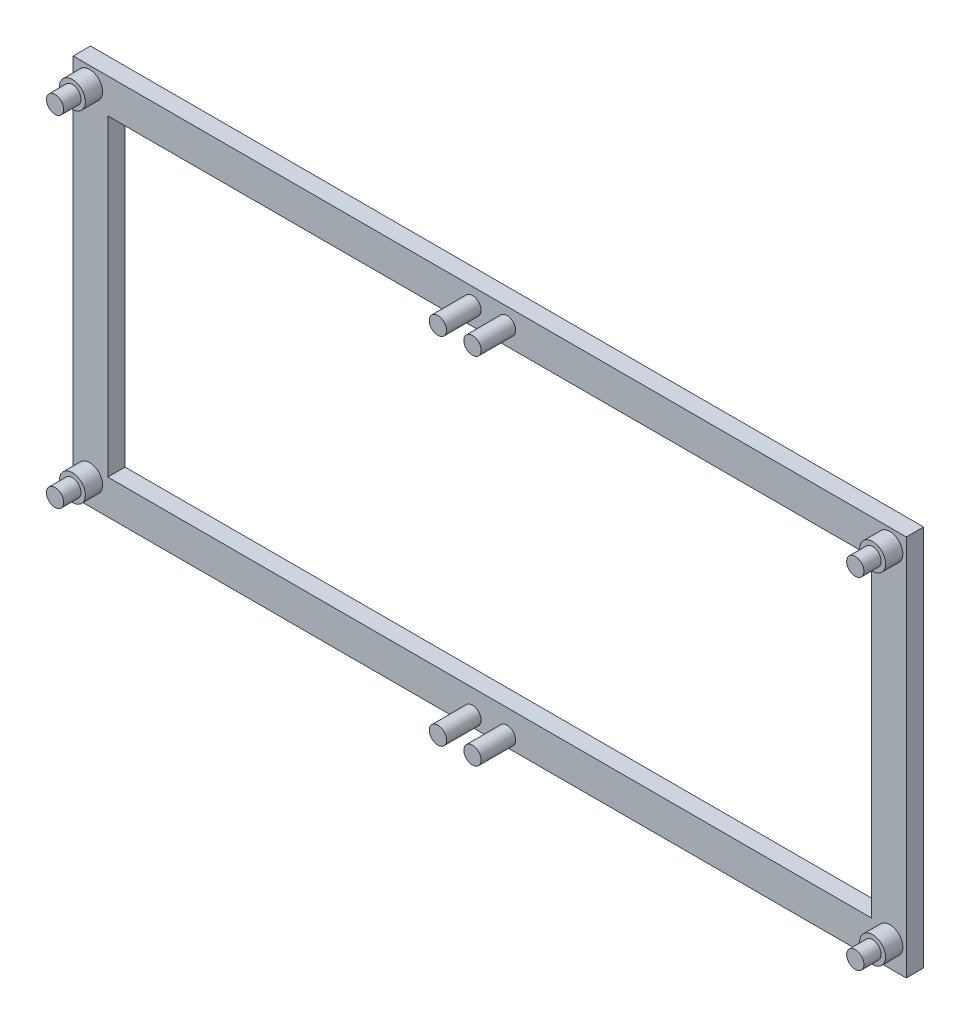
ISO-10303-21;
HEADER;
FILE_DESCRIPTION(('STEP AP214'),'2;1');
FILE_NAME('part.step','',(''),(''),'','','');
FILE_SCHEMA(('AUTOMOTIVE_DESIGN { 1 0 10303 214 1 1 1 1 }'));
ENDSEC;
DATA;
#1=APPLICATION_CONTEXT('core data for automotive mechanical design processes');
#2=APPLICATION_PROTOCOL_DEFINITION('international standard','automotive_design',2000,#1);
#3=PRODUCT_CONTEXT('',#1,'mechanical');
#4=PRODUCT('Part','Part','',(#3));
#5=PRODUCT_RELATED_PRODUCT_CATEGORY('part','',(#4));
#6=PRODUCT_DEFINITION_FORMATION('','',#4);
#7=PRODUCT_DEFINITION_CONTEXT('part definition',#1,'design');
#8=PRODUCT_DEFINITION('design','',#6,#7);
#9=PRODUCT_DEFINITION_SHAPE('','',#8);
#10=(LENGTH_UNIT() NAMED_UNIT(*) SI_UNIT(.MILLI.,.METRE.));
#11=(NAMED_UNIT(*) PLANE_ANGLE_UNIT() SI_UNIT($,.RADIAN.));
#12=(NAMED_UNIT(*) SI_UNIT($,.STERADIAN.) SOLID_ANGLE_UNIT());
#13=UNCERTAINTY_MEASURE_WITH_UNIT(LENGTH_MEASURE(1.E-05),#10,'distance_accuracy_value','');
#14=(GEOMETRIC_REPRESENTATION_CONTEXT(3) GLOBAL_UNCERTAINTY_ASSIGNED_CONTEXT((#13)) GLOBAL_UNIT_ASSIGNED_CONTEXT((#10,
#11,#12)) REPRESENTATION_CONTEXT('',''));
#15=CARTESIAN_POINT('',(0.,0.,0.));
#16=DIRECTION('',(0.,0.,1.));
#17=DIRECTION('',(1.,0.,0.));
#18=AXIS2_PLACEMENT_3D('',#15,#16,#17);
#19=CARTESIAN_POINT('',(0.,0.,2.));
#20=DIRECTION('',(0.,0.,1.));
#21=DIRECTION('',(1.,0.,0.));
#22=AXIS2_PLACEMENT_3D('',#19,#20,#21);
#23=PLANE('',#22);
#24=CARTESIAN_POINT('',(46.3,20.2,2.));
#25=DIRECTION('',(0.,0.,1.));
#26=DIRECTION('',(1.,0.,0.));
#27=AXIS2_PLACEMENT_3D('',#24,#25,#26);
#28=CIRCLE('',#27,1.5);
#29=CARTESIAN_POINT('',(47.8,20.2,2.));
#30=VERTEX_POINT('',#29);
#31=EDGE_CURVE('E192',#30,#30,#28,.T.);
#32=ORIENTED_EDGE('',*,*,#31,.F.);
#33=EDGE_LOOP('',(#32));
#34=FACE_BOUND('',#33,.T.);
#35=CARTESIAN_POINT('',(46.3,-19.2,2.));
#36=DIRECTION('',(0.,0.,1.));
#37=DIRECTION('',(1.,0.,0.));
#38=AXIS2_PLACEMENT_3D('',#35,#36,#37);
#39=CIRCLE('',#38,1.5);
#40=CARTESIAN_POINT('',(47.8,-19.2,2.));
#41=VERTEX_POINT('',#40);
#42=EDGE_CURVE('E185',#41,#41,#39,.T.);
#43=ORIENTED_EDGE('',*,*,#42,.F.);
#44=EDGE_LOOP('',(#43));
#45=FACE_BOUND('',#44,.T.);
#46=CARTESIAN_POINT('',(-46.3,-19.2,2.));
#47=DIRECTION('',(0.,0.,1.));
#48=DIRECTION('',(1.,0.,0.));
#49=AXIS2_PLACEMENT_3D('',#46,#47,#48);
#50=CIRCLE('',#49,1.5);
#51=CARTESIAN_POINT('',(-44.8,-19.2,2.));
#52=VERTEX_POINT('',#51);
#53=EDGE_CURVE('E178',#52,#52,#50,.T.);
#54=ORIENTED_EDGE('',*,*,#53,.F.);
#55=EDGE_LOOP('',(#54));
#56=FACE_BOUND('',#55,.T.);
#57=CARTESIAN_POINT('',(-46.3,20.2,2.));
#58=DIRECTION('',(0.,0.,1.));
#59=DIRECTION('',(1.,0.,0.));
#60=AXIS2_PLACEMENT_3D('',#57,#58,#59);
#61=CIRCLE('',#60,1.5);
#62=CARTESIAN_POINT('',(-44.8,20.2,2.));
#63=VERTEX_POINT('',#62);
#64=EDGE_CURVE('E174',#63,#63,#61,.T.);
#65=ORIENTED_EDGE('',*,*,#64,.F.);
#66=EDGE_LOOP('',(#65));
#67=FACE_BOUND('',#66,.T.);
#68=CARTESIAN_POINT('',(1.99999999999999,-20.862445561139,2.));
#69=DIRECTION('',(0.,0.,1.));
#70=DIRECTION('',(1.,0.,0.));
#71=AXIS2_PLACEMENT_3D('',#68,#69,#70);
#72=CIRCLE('',#71,1.);
#73=CARTESIAN_POINT('',(3.,-20.862445561139,2.));
#74=VERTEX_POINT('',#73);
#75=EDGE_CURVE('E170',#74,#74,#72,.T.);
#76=ORIENTED_EDGE('',*,*,#75,.F.);
#77=EDGE_LOOP('',(#76));
#78=FACE_BOUND('',#77,.T.);
#79=CARTESIAN_POINT('',(1.99999999999999,20.2,2.));
#80=DIRECTION('',(0.,0.,1.));
#81=DIRECTION('',(1.,0.,0.));
#82=AXIS2_PLACEMENT_3D('',#79,#80,#81);
#83=CIRCLE('',#82,1.);
#84=CARTESIAN_POINT('',(2.99999999999999,20.2,2.));
#85=VERTEX_POINT('',#84);
#86=EDGE_CURVE('E204',#85,#85,#83,.T.);
#87=ORIENTED_EDGE('',*,*,#86,.F.);
#88=EDGE_LOOP('',(#87));
#89=FACE_BOUND('',#88,.T.);
#90=CARTESIAN_POINT('',(-2.00000000000001,-20.862445561139,2.));
#91=DIRECTION('',(0.,0.,1.));
#92=DIRECTION('',(1.,0.,0.));
#93=AXIS2_PLACEMENT_3D('',#90,#91,#92);
#94=CIRCLE('',#93,1.);
#95=CARTESIAN_POINT('',(-1.00000000000001,-20.862445561139,2.));
#96=VERTEX_POINT('',#95);
#97=EDGE_CURVE('E210',#96,#96,#94,.T.);
#98=ORIENTED_EDGE('',*,*,#97,.F.);
#99=EDGE_LOOP('',(#98));
#100=FACE_BOUND('',#99,.T.);
#101=CARTESIAN_POINT('',(-2.00000000000001,20.2,2.));
#102=DIRECTION('',(0.,0.,1.));
#103=DIRECTION('',(1.,0.,0.));
#104=AXIS2_PLACEMENT_3D('',#101,#102,#103);
#105=CIRCLE('',#104,1.);
#106=CARTESIAN_POINT('',(-1.00000000000001,20.2,2.));
#107=VERTEX_POINT('',#106);
#108=EDGE_CURVE('E216',#107,#107,#105,.T.);
#109=ORIENTED_EDGE('',*,*,#108,.F.);
#110=EDGE_LOOP('',(#109));
#111=FACE_BOUND('',#110,.T.);
#112=DIRECTION('',(0.,-1.,0.));
#113=VECTOR('',#112,1.);
#114=CARTESIAN_POINT('',(-48.2,-22.1,2.));
#115=LINE('',#114,#113);
#116=CARTESIAN_POINT('',(-48.2,22.1,2.));
#117=VERTEX_POINT('',#116);
#118=CARTESIAN_POINT('',(-48.2,-22.1,2.));
#119=VERTEX_POINT('',#118);
#120=EDGE_CURVE('E142',#117,#119,#115,.T.);
#121=ORIENTED_EDGE('',*,*,#120,.T.);
#122=DIRECTION('',(1.,0.,0.));
#123=VECTOR('',#122,1.);
#124=CARTESIAN_POINT('',(48.2,-22.1,2.));
#125=LINE('',#124,#123);
#126=CARTESIAN_POINT('',(48.2,-22.1,2.));
#127=VERTEX_POINT('',#126);
#128=EDGE_CURVE('E145',#119,#127,#125,.T.);
#129=ORIENTED_EDGE('',*,*,#128,.T.);
#130=DIRECTION('',(0.,1.,0.));
#131=VECTOR('',#130,1.);
#132=CARTESIAN_POINT('',(48.2,-22.1,2.));
#133=LINE('',#132,#131);
#134=CARTESIAN_POINT('',(48.2,22.1,2.));
#135=VERTEX_POINT('',#134);
#136=EDGE_CURVE('E148',#127,#135,#133,.T.);
#137=ORIENTED_EDGE('',*,*,#136,.T.);
#138=DIRECTION('',(-1.,0.,0.));
#139=VECTOR('',#138,1.);
#140=CARTESIAN_POINT('',(48.2,22.1,2.));
#141=LINE('',#140,#139);
#142=EDGE_CURVE('E150',#135,#117,#141,.T.);
#143=ORIENTED_EDGE('',*,*,#142,.T.);
#144=EDGE_LOOP('',(#121,#129,#137,#143));
#145=FACE_BOUND('',#144,.T.);
#146=DIRECTION('',(1.,0.,0.));
#147=VECTOR('',#146,1.);
#148=CARTESIAN_POINT('',(44.2,-18.1,2.));
#149=LINE('',#148,#147);
#150=CARTESIAN_POINT('',(-44.2,-18.1,2.));
#151=VERTEX_POINT('',#150);
#152=CARTESIAN_POINT('',(44.2,-18.1,2.));
#153=VERTEX_POINT('',#152);
#154=EDGE_CURVE('E112',#151,#153,#149,.T.);
#155=ORIENTED_EDGE('',*,*,#154,.F.);
#156=DIRECTION('',(0.,-1.,0.));
#157=VECTOR('',#156,1.);
#158=CARTESIAN_POINT('',(-44.2,-18.1,2.));
#159=LINE('',#158,#157);
#160=CARTESIAN_POINT('',(-44.2,18.1,2.));
#161=VERTEX_POINT('',#160);
#162=EDGE_CURVE('E104',#161,#151,#159,.T.);
#163=ORIENTED_EDGE('',*,*,#162,.F.);
#164=DIRECTION('',(-1.,0.,0.));
#165=VECTOR('',#164,1.);
#166=CARTESIAN_POINT('',(44.2,18.1,2.));
#167=LINE('',#166,#165);
#168=CARTESIAN_POINT('',(44.2,18.1,2.));
#169=VERTEX_POINT('',#168);
#170=EDGE_CURVE('E126',#169,#161,#167,.T.);
#171=ORIENTED_EDGE('',*,*,#170,.F.);
#172=DIRECTION('',(0.,1.,0.));
#173=VECTOR('',#172,1.);
#174=CARTESIAN_POINT('',(44.2,-18.1,2.));
#175=LINE('',#174,#173);
#176=EDGE_CURVE('E124',#153,#169,#175,.T.);
#177=ORIENTED_EDGE('',*,*,#176,.F.);
#178=EDGE_LOOP('',(#155,#163,#171,#177));
#179=FACE_BOUND('',#178,.T.);
#180=ADVANCED_FACE('F37',(#34,#45,#56,#67,#78,#89,#100,#111,#145,#179),#23,.T.);
#181=CARTESIAN_POINT('',(0.,0.,0.));
#182=DIRECTION('',(0.,0.,1.));
#183=DIRECTION('',(1.,0.,0.));
#184=AXIS2_PLACEMENT_3D('',#181,#182,#183);
#185=PLANE('',#184);
#186=DIRECTION('',(0.,-1.,0.));
#187=VECTOR('',#186,1.);
#188=CARTESIAN_POINT('',(-48.2,-22.1,0.));
#189=LINE('',#188,#187);
#190=CARTESIAN_POINT('',(-48.2,22.1,0.));
#191=VERTEX_POINT('',#190);
#192=CARTESIAN_POINT('',(-48.2,-22.1,0.));
#193=VERTEX_POINT('',#192);
#194=EDGE_CURVE('E120',#191,#193,#189,.T.);
#195=ORIENTED_EDGE('',*,*,#194,.F.);
#196=DIRECTION('',(-1.,0.,0.));
#197=VECTOR('',#196,1.);
#198=CARTESIAN_POINT('',(48.2,22.1,0.));
#199=LINE('',#198,#197);
#200=CARTESIAN_POINT('',(48.2,22.1,0.));
#201=VERTEX_POINT('',#200);
#202=EDGE_CURVE('E146',#201,#191,#199,.T.);
#203=ORIENTED_EDGE('',*,*,#202,.F.);
#204=DIRECTION('',(0.,1.,0.));
#205=VECTOR('',#204,1.);
#206=CARTESIAN_POINT('',(48.2,-22.1,0.));
#207=LINE('',#206,#205);
#208=CARTESIAN_POINT('',(48.2,-22.1,0.));
#209=VERTEX_POINT('',#208);
#210=EDGE_CURVE('E157',#209,#201,#207,.T.);
#211=ORIENTED_EDGE('',*,*,#210,.F.);
#212=DIRECTION('',(1.,0.,0.));
#213=VECTOR('',#212,1.);
#214=CARTESIAN_POINT('',(48.2,-22.1,0.));
#215=LINE('',#214,#213);
#216=EDGE_CURVE('E155',#193,#209,#215,.T.);
#217=ORIENTED_EDGE('',*,*,#216,.F.);
#218=EDGE_LOOP('',(#195,#203,#211,#217));
#219=FACE_BOUND('',#218,.T.);
#220=DIRECTION('',(0.,-1.,0.));
#221=VECTOR('',#220,1.);
#222=CARTESIAN_POINT('',(-44.2,-18.1,0.));
#223=LINE('',#222,#221);
#224=CARTESIAN_POINT('',(-44.2,18.1,0.));
#225=VERTEX_POINT('',#224);
#226=CARTESIAN_POINT('',(-44.2,-18.1,0.));
#227=VERTEX_POINT('',#226);
#228=EDGE_CURVE('E62',#225,#227,#223,.T.);
#229=ORIENTED_EDGE('',*,*,#228,.T.);
#230=DIRECTION('',(1.,0.,0.));
#231=VECTOR('',#230,1.);
#232=CARTESIAN_POINT('',(44.2,-18.1,0.));
#233=LINE('',#232,#231);
#234=CARTESIAN_POINT('',(44.2,-18.1,0.));
#235=VERTEX_POINT('',#234);
#236=EDGE_CURVE('E119',#227,#235,#233,.T.);
#237=ORIENTED_EDGE('',*,*,#236,.T.);
#238=DIRECTION('',(0.,1.,0.));
#239=VECTOR('',#238,1.);
#240=CARTESIAN_POINT('',(44.2,-18.1,0.));
#241=LINE('',#240,#239);
#242=CARTESIAN_POINT('',(44.2,18.1,0.));
#243=VERTEX_POINT('',#242);
#244=EDGE_CURVE('E134',#235,#243,#241,.T.);
#245=ORIENTED_EDGE('',*,*,#244,.T.);
#246=DIRECTION('',(-1.,0.,0.));
#247=VECTOR('',#246,1.);
#248=CARTESIAN_POINT('',(44.2,18.1,0.));
#249=LINE('',#248,#247);
#250=EDGE_CURVE('E113',#243,#225,#249,.T.);
#251=ORIENTED_EDGE('',*,*,#250,.T.);
#252=EDGE_LOOP('',(#229,#237,#245,#251));
#253=FACE_BOUND('',#252,.T.);
#254=ADVANCED_FACE('F253',(#219,#253),#185,.F.);
#255=CARTESIAN_POINT('',(-48.2,-22.1,2.));
#256=DIRECTION('',(1.,0.,0.));
#257=DIRECTION('',(0.,0.,-1.));
#258=AXIS2_PLACEMENT_3D('',#255,#256,#257);
#259=PLANE('',#258);
#260=ORIENTED_EDGE('',*,*,#194,.T.);
#261=DIRECTION('',(0.,0.,-1.));
#262=VECTOR('',#261,1.);
#263=CARTESIAN_POINT('',(-48.2,-22.1,2.));
#264=LINE('',#263,#262);
#265=EDGE_CURVE('E11',#119,#193,#264,.T.);
#266=ORIENTED_EDGE('',*,*,#265,.F.);
#267=ORIENTED_EDGE('',*,*,#120,.F.);
#268=DIRECTION('',(0.,0.,-1.));
#269=VECTOR('',#268,1.);
#270=CARTESIAN_POINT('',(-48.2,22.1,2.));
#271=LINE('',#270,#269);
#272=EDGE_CURVE('E152',#117,#191,#271,.T.);
#273=ORIENTED_EDGE('',*,*,#272,.T.);
#274=EDGE_LOOP('',(#260,#266,#267,#273));
#275=FACE_BOUND('',#274,.T.);
#276=ADVANCED_FACE('F39',(#275),#259,.F.);
#277=CARTESIAN_POINT('',(48.2,-22.1,2.));
#278=DIRECTION('',(0.,1.,0.));
#279=DIRECTION('',(-1.,0.,0.));
#280=AXIS2_PLACEMENT_3D('',#277,#278,#279);
#281=PLANE('',#280);
#282=ORIENTED_EDGE('',*,*,#216,.T.);
#283=DIRECTION('',(0.,0.,-1.));
#284=VECTOR('',#283,1.);
#285=CARTESIAN_POINT('',(48.2,-22.1,2.));
#286=LINE('',#285,#284);
#287=EDGE_CURVE('E46',#127,#209,#286,.T.);
#288=ORIENTED_EDGE('',*,*,#287,.F.);
#289=ORIENTED_EDGE('',*,*,#128,.F.);
#290=ORIENTED_EDGE('',*,*,#265,.T.);
#291=EDGE_LOOP('',(#282,#288,#289,#290));
#292=FACE_BOUND('',#291,.T.);
#293=ADVANCED_FACE('F272',(#292),#281,.F.);
#294=CARTESIAN_POINT('',(48.2,-22.1,2.));
#295=DIRECTION('',(-1.,0.,0.));
#296=DIRECTION('',(0.,0.,1.));
#297=AXIS2_PLACEMENT_3D('',#294,#295,#296);
#298=PLANE('',#297);
#299=ORIENTED_EDGE('',*,*,#210,.T.);
#300=DIRECTION('',(0.,0.,-1.));
#301=VECTOR('',#300,1.);
#302=CARTESIAN_POINT('',(48.2,22.1,2.));
#303=LINE('',#302,#301);
#304=EDGE_CURVE('E162',#135,#201,#303,.T.);
#305=ORIENTED_EDGE('',*,*,#304,.F.);
#306=ORIENTED_EDGE('',*,*,#136,.F.);
#307=ORIENTED_EDGE('',*,*,#287,.T.);
#308=EDGE_LOOP('',(#299,#305,#306,#307));
#309=FACE_BOUND('',#308,.T.);
#310=ADVANCED_FACE('F269',(#309),#298,.F.);
#311=CARTESIAN_POINT('',(48.2,22.1,2.));
#312=DIRECTION('',(0.,-1.,0.));
#313=DIRECTION('',(1.,0.,0.));
#314=AXIS2_PLACEMENT_3D('',#311,#312,#313);
#315=PLANE('',#314);
#316=ORIENTED_EDGE('',*,*,#202,.T.);
#317=ORIENTED_EDGE('',*,*,#272,.F.);
#318=ORIENTED_EDGE('',*,*,#142,.F.);
#319=ORIENTED_EDGE('',*,*,#304,.T.);
#320=EDGE_LOOP('',(#316,#317,#318,#319));
#321=FACE_BOUND('',#320,.T.);
#322=ADVANCED_FACE('F266',(#321),#315,.F.);
#323=CARTESIAN_POINT('',(-44.2,-18.1,2.));
#324=DIRECTION('',(1.,0.,0.));
#325=DIRECTION('',(0.,0.,-1.));
#326=AXIS2_PLACEMENT_3D('',#323,#324,#325);
#327=PLANE('',#326);
#328=ORIENTED_EDGE('',*,*,#228,.F.);
#329=DIRECTION('',(0.,0.,-1.));
#330=VECTOR('',#329,1.);
#331=CARTESIAN_POINT('',(-44.2,18.1,2.));
#332=LINE('',#331,#330);
#333=EDGE_CURVE('E108',#161,#225,#332,.T.);
#334=ORIENTED_EDGE('',*,*,#333,.F.);
#335=ORIENTED_EDGE('',*,*,#162,.T.);
#336=DIRECTION('',(0.,0.,-1.));
#337=VECTOR('',#336,1.);
#338=CARTESIAN_POINT('',(-44.2,-18.1,2.));
#339=LINE('',#338,#337);
#340=EDGE_CURVE('E107',#151,#227,#339,.T.);
#341=ORIENTED_EDGE('',*,*,#340,.T.);
#342=EDGE_LOOP('',(#328,#334,#335,#341));
#343=FACE_BOUND('',#342,.T.);
#344=ADVANCED_FACE('F106',(#343),#327,.T.);
#345=CARTESIAN_POINT('',(44.2,-18.1,2.));
#346=DIRECTION('',(0.,1.,0.));
#347=DIRECTION('',(0.,0.,1.));
#348=AXIS2_PLACEMENT_3D('',#345,#346,#347);
#349=PLANE('',#348);
#350=ORIENTED_EDGE('',*,*,#236,.F.);
#351=ORIENTED_EDGE('',*,*,#340,.F.);
#352=ORIENTED_EDGE('',*,*,#154,.T.);
#353=DIRECTION('',(0.,0.,-1.));
#354=VECTOR('',#353,1.);
#355=CARTESIAN_POINT('',(44.2,-18.1,2.));
#356=LINE('',#355,#354);
#357=EDGE_CURVE('E121',#153,#235,#356,.T.);
#358=ORIENTED_EDGE('',*,*,#357,.T.);
#359=EDGE_LOOP('',(#350,#351,#352,#358));
#360=FACE_BOUND('',#359,.T.);
#361=ADVANCED_FACE('F116',(#360),#349,.T.);
#362=CARTESIAN_POINT('',(44.2,-18.1,2.));
#363=DIRECTION('',(-1.,0.,0.));
#364=DIRECTION('',(0.,0.,1.));
#365=AXIS2_PLACEMENT_3D('',#362,#363,#364);
#366=PLANE('',#365);
#367=ORIENTED_EDGE('',*,*,#244,.F.);
#368=ORIENTED_EDGE('',*,*,#357,.F.);
#369=ORIENTED_EDGE('',*,*,#176,.T.);
#370=DIRECTION('',(0.,0.,-1.));
#371=VECTOR('',#370,1.);
#372=CARTESIAN_POINT('',(44.2,18.1,2.));
#373=LINE('',#372,#371);
#374=EDGE_CURVE('E54',#169,#243,#373,.T.);
#375=ORIENTED_EDGE('',*,*,#374,.T.);
#376=EDGE_LOOP('',(#367,#368,#369,#375));
#377=FACE_BOUND('',#376,.T.);
#378=ADVANCED_FACE('F296',(#377),#366,.T.);
#379=CARTESIAN_POINT('',(44.2,18.1,2.));
#380=DIRECTION('',(0.,-1.,0.));
#381=DIRECTION('',(0.,0.,-1.));
#382=AXIS2_PLACEMENT_3D('',#379,#380,#381);
#383=PLANE('',#382);
#384=ORIENTED_EDGE('',*,*,#250,.F.);
#385=ORIENTED_EDGE('',*,*,#374,.F.);
#386=ORIENTED_EDGE('',*,*,#170,.T.);
#387=ORIENTED_EDGE('',*,*,#333,.T.);
#388=EDGE_LOOP('',(#384,#385,#386,#387));
#389=FACE_BOUND('',#388,.T.);
#390=ADVANCED_FACE('F293',(#389),#383,.T.);
#391=CARTESIAN_POINT('',(-2.00000000000001,20.2,6.));
#392=DIRECTION('',(0.,0.,-1.));
#393=DIRECTION('',(-1.,0.,0.));
#394=AXIS2_PLACEMENT_3D('',#391,#392,#393);
#395=CYLINDRICAL_SURFACE('',#394,1.);
#396=CARTESIAN_POINT('',(-2.00000000000001,20.2,6.));
#397=DIRECTION('',(0.,0.,1.));
#398=DIRECTION('',(1.,0.,0.));
#399=AXIS2_PLACEMENT_3D('',#396,#397,#398);
#400=CIRCLE('',#399,1.);
#401=CARTESIAN_POINT('',(-1.00000000000001,20.2,6.));
#402=VERTEX_POINT('',#401);
#403=EDGE_CURVE('E219',#402,#402,#400,.T.);
#404=ORIENTED_EDGE('',*,*,#403,.F.);
#405=EDGE_LOOP('',(#404));
#406=FACE_BOUND('',#405,.T.);
#407=ORIENTED_EDGE('',*,*,#108,.T.);
#408=EDGE_LOOP('',(#407));
#409=FACE_BOUND('',#408,.T.);
#410=ADVANCED_FACE('F295',(#406,#409),#395,.T.);
#411=CARTESIAN_POINT('',(-2.00000000000001,20.2,6.));
#412=DIRECTION('',(0.,0.,1.));
#413=DIRECTION('',(1.,0.,0.));
#414=AXIS2_PLACEMENT_3D('',#411,#412,#413);
#415=PLANE('',#414);
#416=ORIENTED_EDGE('',*,*,#403,.T.);
#417=EDGE_LOOP('',(#416));
#418=FACE_BOUND('',#417,.T.);
#419=ADVANCED_FACE('F301',(#418),#415,.T.);
#420=CARTESIAN_POINT('',(-2.00000000000001,-20.862445561139,6.));
#421=DIRECTION('',(0.,0.,-1.));
#422=DIRECTION('',(-1.,0.,0.));
#423=AXIS2_PLACEMENT_3D('',#420,#421,#422);
#424=CYLINDRICAL_SURFACE('',#423,1.);
#425=CARTESIAN_POINT('',(-2.00000000000001,-20.862445561139,6.));
#426=DIRECTION('',(0.,0.,1.));
#427=DIRECTION('',(1.,0.,0.));
#428=AXIS2_PLACEMENT_3D('',#425,#426,#427);
#429=CIRCLE('',#428,1.);
#430=CARTESIAN_POINT('',(-1.00000000000001,-20.862445561139,6.));
#431=VERTEX_POINT('',#430);
#432=EDGE_CURVE('E213',#431,#431,#429,.T.);
#433=ORIENTED_EDGE('',*,*,#432,.F.);
#434=EDGE_LOOP('',(#433));
#435=FACE_BOUND('',#434,.T.);
#436=ORIENTED_EDGE('',*,*,#97,.T.);
#437=EDGE_LOOP('',(#436));
#438=FACE_BOUND('',#437,.T.);
#439=ADVANCED_FACE('F489',(#435,#438),#424,.T.);
#440=CARTESIAN_POINT('',(-2.00000000000001,-20.862445561139,6.));
#441=DIRECTION('',(0.,0.,1.));
#442=DIRECTION('',(1.,0.,0.));
#443=AXIS2_PLACEMENT_3D('',#440,#441,#442);
#444=PLANE('',#443);
#445=ORIENTED_EDGE('',*,*,#432,.T.);
#446=EDGE_LOOP('',(#445));
#447=FACE_BOUND('',#446,.T.);
#448=ADVANCED_FACE('F499',(#447),#444,.T.);
#449=CARTESIAN_POINT('',(1.99999999999999,20.2,6.));
#450=DIRECTION('',(0.,0.,-1.));
#451=DIRECTION('',(-1.,0.,0.));
#452=AXIS2_PLACEMENT_3D('',#449,#450,#451);
#453=CYLINDRICAL_SURFACE('',#452,1.);
#454=CARTESIAN_POINT('',(1.99999999999999,20.2,6.));
#455=DIRECTION('',(0.,0.,1.));
#456=DIRECTION('',(1.,0.,0.));
#457=AXIS2_PLACEMENT_3D('',#454,#455,#456);
#458=CIRCLE('',#457,1.);
#459=CARTESIAN_POINT('',(2.99999999999999,20.2,6.));
#460=VERTEX_POINT('',#459);
#461=EDGE_CURVE('E207',#460,#460,#458,.T.);
#462=ORIENTED_EDGE('',*,*,#461,.F.);
#463=EDGE_LOOP('',(#462));
#464=FACE_BOUND('',#463,.T.);
#465=ORIENTED_EDGE('',*,*,#86,.T.);
#466=EDGE_LOOP('',(#465));
#467=FACE_BOUND('',#466,.T.);
#468=ADVANCED_FACE('F509',(#464,#467),#453,.T.);
#469=CARTESIAN_POINT('',(1.99999999999999,20.2,6.));
#470=DIRECTION('',(0.,0.,1.));
#471=DIRECTION('',(1.,0.,0.));
#472=AXIS2_PLACEMENT_3D('',#469,#470,#471);
#473=PLANE('',#472);
#474=ORIENTED_EDGE('',*,*,#461,.T.);
#475=EDGE_LOOP('',(#474));
#476=FACE_BOUND('',#475,.T.);
#477=ADVANCED_FACE('F519',(#476),#473,.T.);
#478=CARTESIAN_POINT('',(1.99999999999999,-20.862445561139,6.));
#479=DIRECTION('',(0.,0.,-1.));
#480=DIRECTION('',(-1.,0.,0.));
#481=AXIS2_PLACEMENT_3D('',#478,#479,#480);
#482=CYLINDRICAL_SURFACE('',#481,1.);
#483=CARTESIAN_POINT('',(1.99999999999999,-20.862445561139,6.));
#484=DIRECTION('',(0.,0.,1.));
#485=DIRECTION('',(1.,0.,0.));
#486=AXIS2_PLACEMENT_3D('',#483,#484,#485);
#487=CIRCLE('',#486,1.);
#488=CARTESIAN_POINT('',(3.,-20.862445561139,6.));
#489=VERTEX_POINT('',#488);
#490=EDGE_CURVE('E201',#489,#489,#487,.T.);
#491=ORIENTED_EDGE('',*,*,#490,.F.);
#492=EDGE_LOOP('',(#491));
#493=FACE_BOUND('',#492,.T.);
#494=ORIENTED_EDGE('',*,*,#75,.T.);
#495=EDGE_LOOP('',(#494));
#496=FACE_BOUND('',#495,.T.);
#497=ADVANCED_FACE('F528',(#493,#496),#482,.T.);
#498=CARTESIAN_POINT('',(1.99999999999999,-20.862445561139,6.));
#499=DIRECTION('',(0.,0.,1.));
#500=DIRECTION('',(1.,0.,0.));
#501=AXIS2_PLACEMENT_3D('',#498,#499,#500);
#502=PLANE('',#501);
#503=ORIENTED_EDGE('',*,*,#490,.T.);
#504=EDGE_LOOP('',(#503));
#505=FACE_BOUND('',#504,.T.);
#506=ADVANCED_FACE('F346',(#505),#502,.T.);
#507=CARTESIAN_POINT('',(-46.3,20.2,4.));
#508=DIRECTION('',(0.,0.,-1.));
#509=DIRECTION('',(-1.,0.,0.));
#510=AXIS2_PLACEMENT_3D('',#507,#508,#509);
#511=CYLINDRICAL_SURFACE('',#510,1.5);
#512=CARTESIAN_POINT('',(-46.3,20.2,4.));
#513=DIRECTION('',(0.,0.,1.));
#514=DIRECTION('',(1.,0.,0.));
#515=AXIS2_PLACEMENT_3D('',#512,#513,#514);
#516=CIRCLE('',#515,1.5);
#517=CARTESIAN_POINT('',(-44.8,20.2,4.));
#518=VERTEX_POINT('',#517);
#519=EDGE_CURVE('E171',#518,#518,#516,.T.);
#520=ORIENTED_EDGE('',*,*,#519,.F.);
#521=EDGE_LOOP('',(#520));
#522=FACE_BOUND('',#521,.T.);
#523=ORIENTED_EDGE('',*,*,#64,.T.);
#524=EDGE_LOOP('',(#523));
#525=FACE_BOUND('',#524,.T.);
#526=ADVANCED_FACE('F351',(#522,#525),#511,.T.);
#527=CARTESIAN_POINT('',(-46.3,20.2,4.));
#528=DIRECTION('',(0.,0.,1.));
#529=DIRECTION('',(1.,0.,0.));
#530=AXIS2_PLACEMENT_3D('',#527,#528,#529);
#531=PLANE('',#530);
#532=CARTESIAN_POINT('',(-46.3,20.2,4.));
#533=DIRECTION('',(0.,0.,1.));
#534=DIRECTION('',(1.,0.,0.));
#535=AXIS2_PLACEMENT_3D('',#532,#533,#534);
#536=CIRCLE('',#535,0.999999999999998);
#537=CARTESIAN_POINT('',(-45.3,20.2,4.));
#538=VERTEX_POINT('',#537);
#539=EDGE_CURVE('E167',#538,#538,#536,.T.);
#540=ORIENTED_EDGE('',*,*,#539,.F.);
#541=EDGE_LOOP('',(#540));
#542=FACE_BOUND('',#541,.T.);
#543=ORIENTED_EDGE('',*,*,#519,.T.);
#544=EDGE_LOOP('',(#543));
#545=FACE_BOUND('',#544,.T.);
#546=ADVANCED_FACE('F249',(#542,#545),#531,.T.);
#547=CARTESIAN_POINT('',(-46.3,20.2,6.));
#548=DIRECTION('',(0.,0.,1.));
#549=DIRECTION('',(1.,0.,0.));
#550=AXIS2_PLACEMENT_3D('',#547,#548,#549);
#551=PLANE('',#550);
#552=CARTESIAN_POINT('',(-46.3,20.2,6.));
#553=DIRECTION('',(0.,0.,1.));
#554=DIRECTION('',(1.,0.,0.));
#555=AXIS2_PLACEMENT_3D('',#552,#553,#554);
#556=CIRCLE('',#555,0.999999999999998);
#557=CARTESIAN_POINT('',(-45.3,20.2,6.));
#558=VERTEX_POINT('',#557);
#559=EDGE_CURVE('E132',#558,#558,#556,.T.);
#560=ORIENTED_EDGE('',*,*,#559,.T.);
#561=EDGE_LOOP('',(#560));
#562=FACE_BOUND('',#561,.T.);
#563=ADVANCED_FACE('F235',(#562),#551,.T.);
#564=CARTESIAN_POINT('',(-46.3,20.2,6.));
#565=DIRECTION('',(0.,0.,-1.));
#566=DIRECTION('',(-1.,0.,0.));
#567=AXIS2_PLACEMENT_3D('',#564,#565,#566);
#568=CYLINDRICAL_SURFACE('',#567,0.999999999999998);
#569=ORIENTED_EDGE('',*,*,#539,.T.);
#570=EDGE_LOOP('',(#569));
#571=FACE_BOUND('',#570,.T.);
#572=ORIENTED_EDGE('',*,*,#559,.F.);
#573=EDGE_LOOP('',(#572));
#574=FACE_BOUND('',#573,.T.);
#575=ADVANCED_FACE('F237',(#571,#574),#568,.T.);
#576=CARTESIAN_POINT('',(-46.3,-19.2,4.));
#577=DIRECTION('',(0.,0.,-1.));
#578=DIRECTION('',(-1.,0.,0.));
#579=AXIS2_PLACEMENT_3D('',#576,#577,#578);
#580=CYLINDRICAL_SURFACE('',#579,1.5);
#581=CARTESIAN_POINT('',(-46.3,-19.2,4.));
#582=DIRECTION('',(0.,0.,1.));
#583=DIRECTION('',(1.,0.,0.));
#584=AXIS2_PLACEMENT_3D('',#581,#582,#583);
#585=CIRCLE('',#584,1.5);
#586=CARTESIAN_POINT('',(-44.8,-19.2,4.));
#587=VERTEX_POINT('',#586);
#588=EDGE_CURVE('E175',#587,#587,#585,.T.);
#589=ORIENTED_EDGE('',*,*,#588,.F.);
#590=EDGE_LOOP('',(#589));
#591=FACE_BOUND('',#590,.T.);
#592=ORIENTED_EDGE('',*,*,#53,.T.);
#593=EDGE_LOOP('',(#592));
#594=FACE_BOUND('',#593,.T.);
#595=ADVANCED_FACE('F239',(#591,#594),#580,.T.);
#596=CARTESIAN_POINT('',(-46.3,-19.2,4.));
#597=DIRECTION('',(0.,0.,1.));
#598=DIRECTION('',(1.,0.,0.));
#599=AXIS2_PLACEMENT_3D('',#596,#597,#598);
#600=PLANE('',#599);
#601=CARTESIAN_POINT('',(-46.3,-19.2,4.));
#602=DIRECTION('',(0.,0.,1.));
#603=DIRECTION('',(1.,0.,0.));
#604=AXIS2_PLACEMENT_3D('',#601,#602,#603);
#605=CIRCLE('',#604,0.999999999999998);
#606=CARTESIAN_POINT('',(-45.3,-19.2,4.));
#607=VERTEX_POINT('',#606);
#608=EDGE_CURVE('E172',#607,#607,#605,.T.);
#609=ORIENTED_EDGE('',*,*,#608,.F.);
#610=EDGE_LOOP('',(#609));
#611=FACE_BOUND('',#610,.T.);
#612=ORIENTED_EDGE('',*,*,#588,.T.);
#613=EDGE_LOOP('',(#612));
#614=FACE_BOUND('',#613,.T.);
#615=ADVANCED_FACE('F246',(#611,#614),#600,.T.);
#616=CARTESIAN_POINT('',(-46.3,-19.2,6.));
#617=DIRECTION('',(0.,0.,1.));
#618=DIRECTION('',(1.,0.,0.));
#619=AXIS2_PLACEMENT_3D('',#616,#617,#618);
#620=PLANE('',#619);
#621=CARTESIAN_POINT('',(-46.3,-19.2,6.));
#622=DIRECTION('',(0.,0.,1.));
#623=DIRECTION('',(1.,0.,0.));
#624=AXIS2_PLACEMENT_3D('',#621,#622,#623);
#625=CIRCLE('',#624,0.999999999999998);
#626=CARTESIAN_POINT('',(-45.3,-19.2,6.));
#627=VERTEX_POINT('',#626);
#628=EDGE_CURVE('E230',#627,#627,#625,.T.);
#629=ORIENTED_EDGE('',*,*,#628,.T.);
#630=EDGE_LOOP('',(#629));
#631=FACE_BOUND('',#630,.T.);
#632=ADVANCED_FACE('F386',(#631),#620,.T.);
#633=CARTESIAN_POINT('',(-46.3,-19.2,6.));
#634=DIRECTION('',(0.,0.,-1.));
#635=DIRECTION('',(-1.,0.,0.));
#636=AXIS2_PLACEMENT_3D('',#633,#634,#635);
#637=CYLINDRICAL_SURFACE('',#636,0.999999999999998);
#638=ORIENTED_EDGE('',*,*,#608,.T.);
#639=EDGE_LOOP('',(#638));
#640=FACE_BOUND('',#639,.T.);
#641=ORIENTED_EDGE('',*,*,#628,.F.);
#642=EDGE_LOOP('',(#641));
#643=FACE_BOUND('',#642,.T.);
#644=ADVANCED_FACE('F394',(#640,#643),#637,.T.);
#645=CARTESIAN_POINT('',(46.3,-19.2,4.));
#646=DIRECTION('',(0.,0.,-1.));
#647=DIRECTION('',(-1.,0.,0.));
#648=AXIS2_PLACEMENT_3D('',#645,#646,#647);
#649=CYLINDRICAL_SURFACE('',#648,1.5);
#650=CARTESIAN_POINT('',(46.3,-19.2,4.));
#651=DIRECTION('',(0.,0.,1.));
#652=DIRECTION('',(1.,0.,0.));
#653=AXIS2_PLACEMENT_3D('',#650,#651,#652);
#654=CIRCLE('',#653,1.5);
#655=CARTESIAN_POINT('',(47.8,-19.2,4.));
#656=VERTEX_POINT('',#655);
#657=EDGE_CURVE('E179',#656,#656,#654,.T.);
#658=ORIENTED_EDGE('',*,*,#657,.F.);
#659=EDGE_LOOP('',(#658));
#660=FACE_BOUND('',#659,.T.);
#661=ORIENTED_EDGE('',*,*,#42,.T.);
#662=EDGE_LOOP('',(#661));
#663=FACE_BOUND('',#662,.T.);
#664=ADVANCED_FACE('F399',(#660,#663),#649,.T.);
#665=CARTESIAN_POINT('',(46.3,-19.2,4.));
#666=DIRECTION('',(0.,0.,1.));
#667=DIRECTION('',(1.,0.,0.));
#668=AXIS2_PLACEMENT_3D('',#665,#666,#667);
#669=PLANE('',#668);
#670=CARTESIAN_POINT('',(46.3,-19.2,4.));
#671=DIRECTION('',(0.,0.,1.));
#672=DIRECTION('',(1.,0.,0.));
#673=AXIS2_PLACEMENT_3D('',#670,#671,#672);
#674=CIRCLE('',#673,0.999999999999998);
#675=CARTESIAN_POINT('',(47.3,-19.2,4.));
#676=VERTEX_POINT('',#675);
#677=EDGE_CURVE('E176',#676,#676,#674,.T.);
#678=ORIENTED_EDGE('',*,*,#677,.F.);
#679=EDGE_LOOP('',(#678));
#680=FACE_BOUND('',#679,.T.);
#681=ORIENTED_EDGE('',*,*,#657,.T.);
#682=EDGE_LOOP('',(#681));
#683=FACE_BOUND('',#682,.T.);
#684=ADVANCED_FACE('F409',(#680,#683),#669,.T.);
#685=CARTESIAN_POINT('',(46.3,-19.2,6.));
#686=DIRECTION('',(0.,0.,1.));
#687=DIRECTION('',(1.,0.,0.));
#688=AXIS2_PLACEMENT_3D('',#685,#686,#687);
#689=PLANE('',#688);
#690=CARTESIAN_POINT('',(46.3,-19.2,6.));
#691=DIRECTION('',(0.,0.,1.));
#692=DIRECTION('',(1.,0.,0.));
#693=AXIS2_PLACEMENT_3D('',#690,#691,#692);
#694=CIRCLE('',#693,0.999999999999998);
#695=CARTESIAN_POINT('',(47.3,-19.2,6.));
#696=VERTEX_POINT('',#695);
#697=EDGE_CURVE('E227',#696,#696,#694,.T.);
#698=ORIENTED_EDGE('',*,*,#697,.T.);
#699=EDGE_LOOP('',(#698));
#700=FACE_BOUND('',#699,.T.);
#701=ADVANCED_FACE('F419',(#700),#689,.T.);
#702=CARTESIAN_POINT('',(46.3,-19.2,6.));
#703=DIRECTION('',(0.,0.,-1.));
#704=DIRECTION('',(-1.,0.,0.));
#705=AXIS2_PLACEMENT_3D('',#702,#703,#704);
#706=CYLINDRICAL_SURFACE('',#705,0.999999999999998);
#707=ORIENTED_EDGE('',*,*,#677,.T.);
#708=EDGE_LOOP('',(#707));
#709=FACE_BOUND('',#708,.T.);
#710=ORIENTED_EDGE('',*,*,#697,.F.);
#711=EDGE_LOOP('',(#710));
#712=FACE_BOUND('',#711,.T.);
#713=ADVANCED_FACE('F427',(#709,#712),#706,.T.);
#714=CARTESIAN_POINT('',(46.3,20.2,4.));
#715=DIRECTION('',(0.,0.,-1.));
#716=DIRECTION('',(-1.,0.,0.));
#717=AXIS2_PLACEMENT_3D('',#714,#715,#716);
#718=CYLINDRICAL_SURFACE('',#717,1.5);
#719=CARTESIAN_POINT('',(46.3,20.2,4.));
#720=DIRECTION('',(0.,0.,1.));
#721=DIRECTION('',(1.,0.,0.));
#722=AXIS2_PLACEMENT_3D('',#719,#720,#721);
#723=CIRCLE('',#722,1.5);
#724=CARTESIAN_POINT('',(47.8,20.2,4.));
#725=VERTEX_POINT('',#724);
#726=EDGE_CURVE('E604',#725,#725,#723,.T.);
#727=ORIENTED_EDGE('',*,*,#726,.F.);
#728=EDGE_LOOP('',(#727));
#729=FACE_BOUND('',#728,.T.);
#730=ORIENTED_EDGE('',*,*,#31,.T.);
#731=EDGE_LOOP('',(#730));
#732=FACE_BOUND('',#731,.T.);
#733=ADVANCED_FACE('F432',(#729,#732),#718,.T.);
#734=CARTESIAN_POINT('',(46.3,20.2,4.));
#735=DIRECTION('',(0.,0.,1.));
#736=DIRECTION('',(1.,0.,0.));
#737=AXIS2_PLACEMENT_3D('',#734,#735,#736);
#738=PLANE('',#737);
#739=CARTESIAN_POINT('',(46.3,20.2,4.));
#740=DIRECTION('',(0.,0.,1.));
#741=DIRECTION('',(1.,0.,0.));
#742=AXIS2_PLACEMENT_3D('',#739,#740,#741);
#743=CIRCLE('',#742,0.999999999999998);
#744=CARTESIAN_POINT('',(47.3,20.2,4.));
#745=VERTEX_POINT('',#744);
#746=EDGE_CURVE('E41',#745,#745,#743,.T.);
#747=ORIENTED_EDGE('',*,*,#746,.F.);
#748=EDGE_LOOP('',(#747));
#749=FACE_BOUND('',#748,.T.);
#750=ORIENTED_EDGE('',*,*,#726,.T.);
#751=EDGE_LOOP('',(#750));
#752=FACE_BOUND('',#751,.T.);
#753=ADVANCED_FACE('F441',(#749,#752),#738,.T.);
#754=CARTESIAN_POINT('',(46.3,20.2,6.));
#755=DIRECTION('',(0.,0.,1.));
#756=DIRECTION('',(1.,0.,0.));
#757=AXIS2_PLACEMENT_3D('',#754,#755,#756);
#758=PLANE('',#757);
#759=CARTESIAN_POINT('',(46.3,20.2,6.));
#760=DIRECTION('',(0.,0.,1.));
#761=DIRECTION('',(1.,0.,0.));
#762=AXIS2_PLACEMENT_3D('',#759,#760,#761);
#763=CIRCLE('',#762,0.999999999999998);
#764=CARTESIAN_POINT('',(47.3,20.2,6.));
#765=VERTEX_POINT('',#764);
#766=EDGE_CURVE('E222',#765,#765,#763,.T.);
#767=ORIENTED_EDGE('',*,*,#766,.T.);
#768=EDGE_LOOP('',(#767));
#769=FACE_BOUND('',#768,.T.);
#770=ADVANCED_FACE('F451',(#769),#758,.T.);
#771=CARTESIAN_POINT('',(46.3,20.2,6.));
#772=DIRECTION('',(0.,0.,-1.));
#773=DIRECTION('',(-1.,0.,0.));
#774=AXIS2_PLACEMENT_3D('',#771,#772,#773);
#775=CYLINDRICAL_SURFACE('',#774,0.999999999999998);
#776=ORIENTED_EDGE('',*,*,#746,.T.);
#777=EDGE_LOOP('',(#776));
#778=FACE_BOUND('',#777,.T.);
#779=ORIENTED_EDGE('',*,*,#766,.F.);
#780=EDGE_LOOP('',(#779));
#781=FACE_BOUND('',#780,.T.);
#782=ADVANCED_FACE('F458',(#778,#781),#775,.T.);
#783=CLOSED_SHELL('',(#180,#254,#276,#293,#310,#322,#344,#361,#378,#390,#410,#419,#439,#448,
#468,#477,#497,#506,#526,#546,#563,#575,#595,#615,#632,#644,#664,#684,#701,#713,#733,#753,#770,#782));
#784=MANIFOLD_SOLID_BREP('B2',#783);
#785=ADVANCED_BREP_SHAPE_REPRESENTATION('',(#18,#784),#14);
#786=SHAPE_DEFINITION_REPRESENTATION(#9,#785);
ENDSEC;
END-ISO-10303-21;
